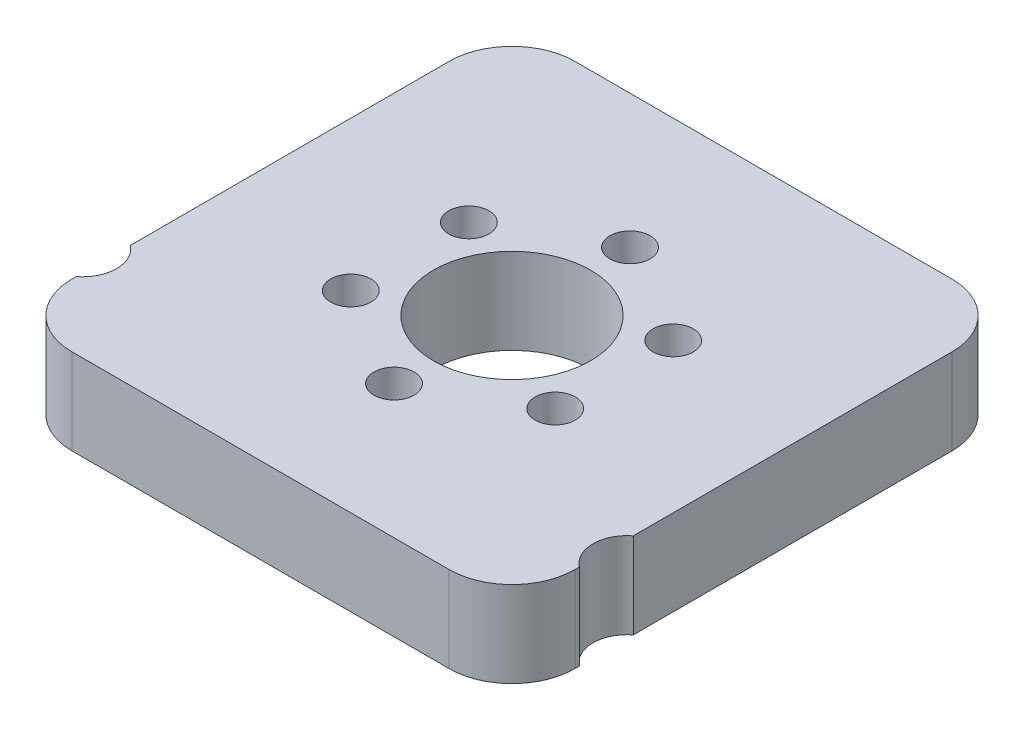
ISO-10303-21;
HEADER;
FILE_DESCRIPTION(('STEP AP214'),'2;1');
FILE_NAME('part.step','',(''),(''),'','','');
FILE_SCHEMA(('AUTOMOTIVE_DESIGN { 1 0 10303 214 1 1 1 1 }'));
ENDSEC;
DATA;
#1=APPLICATION_CONTEXT('core data for automotive mechanical design processes');
#2=APPLICATION_PROTOCOL_DEFINITION('international standard','automotive_design',2000,#1);
#3=PRODUCT_CONTEXT('',#1,'mechanical');
#4=PRODUCT('Part','Part','',(#3));
#5=PRODUCT_RELATED_PRODUCT_CATEGORY('part','',(#4));
#6=PRODUCT_DEFINITION_FORMATION('','',#4);
#7=PRODUCT_DEFINITION_CONTEXT('part definition',#1,'design');
#8=PRODUCT_DEFINITION('design','',#6,#7);
#9=PRODUCT_DEFINITION_SHAPE('','',#8);
#10=(LENGTH_UNIT() NAMED_UNIT(*) SI_UNIT(.MILLI.,.METRE.));
#11=(NAMED_UNIT(*) PLANE_ANGLE_UNIT() SI_UNIT($,.RADIAN.));
#12=(NAMED_UNIT(*) SI_UNIT($,.STERADIAN.) SOLID_ANGLE_UNIT());
#13=UNCERTAINTY_MEASURE_WITH_UNIT(LENGTH_MEASURE(1.E-05),#10,'distance_accuracy_value','');
#14=(GEOMETRIC_REPRESENTATION_CONTEXT(3) GLOBAL_UNCERTAINTY_ASSIGNED_CONTEXT((#13)) GLOBAL_UNIT_ASSIGNED_CONTEXT((#10,
#11,#12)) REPRESENTATION_CONTEXT('',''));
#15=CARTESIAN_POINT('',(0.,0.,0.));
#16=DIRECTION('',(0.,0.,1.));
#17=DIRECTION('',(1.,0.,0.));
#18=AXIS2_PLACEMENT_3D('',#15,#16,#17);
#19=CARTESIAN_POINT('',(-21.6506350946094,6.825,12.5000000000009));
#20=DIRECTION('',(0.,-1.,0.));
#21=DIRECTION('',(0.,0.,-1.));
#22=AXIS2_PLACEMENT_3D('',#19,#20,#21);
#23=CYLINDRICAL_SURFACE('',#22,2.70726574872096);
#24=CARTESIAN_POINT('',(-21.6506350946094,0.,12.5000000000009));
#25=DIRECTION('',(0.,1.,0.));
#26=DIRECTION('',(0.,0.,1.));
#27=AXIS2_PLACEMENT_3D('',#24,#25,#26);
#28=CIRCLE('',#27,2.70726574872096);
#29=CARTESIAN_POINT('',(-20.,0.,14.6458545194504));
#30=VERTEX_POINT('',#29);
#31=CARTESIAN_POINT('',(-20.,0.,10.3541454805515));
#32=VERTEX_POINT('',#31);
#33=EDGE_CURVE('E153',#30,#32,#28,.T.);
#34=ORIENTED_EDGE('',*,*,#33,.F.);
#35=DIRECTION('',(0.,-1.,0.));
#36=VECTOR('',#35,1.);
#37=CARTESIAN_POINT('',(-20.,6.825,14.6458545194504));
#38=LINE('',#37,#36);
#39=CARTESIAN_POINT('',(-20.,6.825,14.6458545194504));
#40=VERTEX_POINT('',#39);
#41=EDGE_CURVE('E140',#40,#30,#38,.T.);
#42=ORIENTED_EDGE('',*,*,#41,.F.);
#43=CARTESIAN_POINT('',(-21.6506350946094,6.825,12.5000000000009));
#44=DIRECTION('',(0.,1.,0.));
#45=DIRECTION('',(0.,0.,1.));
#46=AXIS2_PLACEMENT_3D('',#43,#44,#45);
#47=CIRCLE('',#46,2.70726574872096);
#48=CARTESIAN_POINT('',(-20.,6.825,10.3541454805515));
#49=VERTEX_POINT('',#48);
#50=EDGE_CURVE('E147',#40,#49,#47,.T.);
#51=ORIENTED_EDGE('',*,*,#50,.T.);
#52=DIRECTION('',(0.,-1.,0.));
#53=VECTOR('',#52,1.);
#54=CARTESIAN_POINT('',(-20.,6.825,10.3541454805515));
#55=LINE('',#54,#53);
#56=EDGE_CURVE('E189',#49,#32,#55,.T.);
#57=ORIENTED_EDGE('',*,*,#56,.T.);
#58=EDGE_LOOP('',(#34,#42,#51,#57));
#59=FACE_BOUND('',#58,.T.);
#60=ADVANCED_FACE('F45',(#59),#23,.F.);
#61=CARTESIAN_POINT('',(-20.,6.825,0.));
#62=DIRECTION('',(-1.,0.,0.));
#63=DIRECTION('',(0.,0.,1.));
#64=AXIS2_PLACEMENT_3D('',#61,#62,#63);
#65=PLANE('',#64);
#66=DIRECTION('',(0.,0.,-1.));
#67=VECTOR('',#66,1.);
#68=CARTESIAN_POINT('',(-20.,0.,0.));
#69=LINE('',#68,#67);
#70=CARTESIAN_POINT('',(-20.,0.,15.));
#71=VERTEX_POINT('',#70);
#72=EDGE_CURVE('E192',#71,#30,#69,.T.);
#73=ORIENTED_EDGE('',*,*,#72,.F.);
#74=DIRECTION('',(0.,-1.,0.));
#75=VECTOR('',#74,1.);
#76=CARTESIAN_POINT('',(-20.,6.825,15.));
#77=LINE('',#76,#75);
#78=CARTESIAN_POINT('',(-20.,6.825,15.));
#79=VERTEX_POINT('',#78);
#80=EDGE_CURVE('E11',#71,#79,#77,.F.);
#81=ORIENTED_EDGE('',*,*,#80,.T.);
#82=DIRECTION('',(0.,0.,-1.));
#83=VECTOR('',#82,1.);
#84=CARTESIAN_POINT('',(-20.,6.825,0.));
#85=LINE('',#84,#83);
#86=EDGE_CURVE('E136',#79,#40,#85,.T.);
#87=ORIENTED_EDGE('',*,*,#86,.T.);
#88=ORIENTED_EDGE('',*,*,#41,.T.);
#89=EDGE_LOOP('',(#73,#81,#87,#88));
#90=FACE_BOUND('',#89,.T.);
#91=ADVANCED_FACE('F139',(#90),#65,.T.);
#92=CARTESIAN_POINT('',(0.,6.825,20.));
#93=DIRECTION('',(0.,0.,-1.));
#94=DIRECTION('',(-1.,0.,0.));
#95=AXIS2_PLACEMENT_3D('',#92,#93,#94);
#96=PLANE('',#95);
#97=DIRECTION('',(1.,0.,0.));
#98=VECTOR('',#97,1.);
#99=CARTESIAN_POINT('',(0.,0.,20.));
#100=LINE('',#99,#98);
#101=CARTESIAN_POINT('',(-15.,0.,20.));
#102=VERTEX_POINT('',#101);
#103=CARTESIAN_POINT('',(15.,0.,20.));
#104=VERTEX_POINT('',#103);
#105=EDGE_CURVE('E196',#102,#104,#100,.T.);
#106=ORIENTED_EDGE('',*,*,#105,.T.);
#107=DIRECTION('',(0.,-1.,0.));
#108=VECTOR('',#107,1.);
#109=CARTESIAN_POINT('',(15.,6.825,20.));
#110=LINE('',#109,#108);
#111=CARTESIAN_POINT('',(15.,6.825,20.));
#112=VERTEX_POINT('',#111);
#113=EDGE_CURVE('E239',#104,#112,#110,.F.);
#114=ORIENTED_EDGE('',*,*,#113,.T.);
#115=DIRECTION('',(1.,0.,0.));
#116=VECTOR('',#115,1.);
#117=CARTESIAN_POINT('',(0.,6.825,20.));
#118=LINE('',#117,#116);
#119=CARTESIAN_POINT('',(-15.,6.825,20.));
#120=VERTEX_POINT('',#119);
#121=EDGE_CURVE('E146',#120,#112,#118,.T.);
#122=ORIENTED_EDGE('',*,*,#121,.F.);
#123=DIRECTION('',(0.,-1.,0.));
#124=VECTOR('',#123,1.);
#125=CARTESIAN_POINT('',(-15.,0.,20.));
#126=LINE('',#125,#124);
#127=EDGE_CURVE('E235',#120,#102,#126,.T.);
#128=ORIENTED_EDGE('',*,*,#127,.T.);
#129=EDGE_LOOP('',(#106,#114,#122,#128));
#130=FACE_BOUND('',#129,.T.);
#131=ADVANCED_FACE('F366',(#130),#96,.F.);
#132=CARTESIAN_POINT('',(20.,6.825,0.));
#133=DIRECTION('',(-1.,0.,0.));
#134=DIRECTION('',(0.,0.,1.));
#135=AXIS2_PLACEMENT_3D('',#132,#133,#134);
#136=PLANE('',#135);
#137=DIRECTION('',(0.,0.,-1.));
#138=VECTOR('',#137,1.);
#139=CARTESIAN_POINT('',(20.,6.825,0.));
#140=LINE('',#139,#138);
#141=CARTESIAN_POINT('',(20.,6.825,15.));
#142=VERTEX_POINT('',#141);
#143=CARTESIAN_POINT('',(20.,6.825,14.6458545194452));
#144=VERTEX_POINT('',#143);
#145=EDGE_CURVE('E174',#142,#144,#140,.T.);
#146=ORIENTED_EDGE('',*,*,#145,.F.);
#147=DIRECTION('',(0.,-1.,0.));
#148=VECTOR('',#147,1.);
#149=CARTESIAN_POINT('',(20.,6.825,15.));
#150=LINE('',#149,#148);
#151=CARTESIAN_POINT('',(20.,0.,15.));
#152=VERTEX_POINT('',#151);
#153=EDGE_CURVE('E155',#142,#152,#150,.T.);
#154=ORIENTED_EDGE('',*,*,#153,.T.);
#155=DIRECTION('',(0.,0.,-1.));
#156=VECTOR('',#155,1.);
#157=CARTESIAN_POINT('',(20.,0.,0.));
#158=LINE('',#157,#156);
#159=CARTESIAN_POINT('',(20.,0.,14.6458545194452));
#160=VERTEX_POINT('',#159);
#161=EDGE_CURVE('E200',#152,#160,#158,.T.);
#162=ORIENTED_EDGE('',*,*,#161,.T.);
#163=DIRECTION('',(0.,-1.,0.));
#164=VECTOR('',#163,1.);
#165=CARTESIAN_POINT('',(20.,6.825,14.6458545194452));
#166=LINE('',#165,#164);
#167=EDGE_CURVE('E156',#144,#160,#166,.T.);
#168=ORIENTED_EDGE('',*,*,#167,.F.);
#169=EDGE_LOOP('',(#146,#154,#162,#168));
#170=FACE_BOUND('',#169,.T.);
#171=ADVANCED_FACE('F401',(#170),#136,.F.);
#172=CARTESIAN_POINT('',(21.6506350946126,6.825,12.4999999999991));
#173=DIRECTION('',(0.,-1.,0.));
#174=DIRECTION('',(0.,0.,-1.));
#175=AXIS2_PLACEMENT_3D('',#172,#173,#174);
#176=CYLINDRICAL_SURFACE('',#175,2.70726574872033);
#177=CARTESIAN_POINT('',(21.6506350946126,0.,12.4999999999991));
#178=DIRECTION('',(0.,1.,0.));
#179=DIRECTION('',(0.,0.,1.));
#180=AXIS2_PLACEMENT_3D('',#177,#178,#179);
#181=CIRCLE('',#180,2.70726574872033);
#182=CARTESIAN_POINT('',(20.,0.,10.3541454805529));
#183=VERTEX_POINT('',#182);
#184=EDGE_CURVE('E203',#183,#160,#181,.T.);
#185=ORIENTED_EDGE('',*,*,#184,.F.);
#186=DIRECTION('',(0.,-1.,0.));
#187=VECTOR('',#186,1.);
#188=CARTESIAN_POINT('',(20.,6.825,10.3541454805529));
#189=LINE('',#188,#187);
#190=CARTESIAN_POINT('',(20.,6.825,10.3541454805529));
#191=VERTEX_POINT('',#190);
#192=EDGE_CURVE('E214',#191,#183,#189,.T.);
#193=ORIENTED_EDGE('',*,*,#192,.F.);
#194=CARTESIAN_POINT('',(21.6506350946126,6.825,12.4999999999991));
#195=DIRECTION('',(0.,1.,0.));
#196=DIRECTION('',(0.,0.,1.));
#197=AXIS2_PLACEMENT_3D('',#194,#195,#196);
#198=CIRCLE('',#197,2.70726574872033);
#199=EDGE_CURVE('E177',#191,#144,#198,.T.);
#200=ORIENTED_EDGE('',*,*,#199,.T.);
#201=ORIENTED_EDGE('',*,*,#167,.T.);
#202=EDGE_LOOP('',(#185,#193,#200,#201));
#203=FACE_BOUND('',#202,.T.);
#204=ADVANCED_FACE('F396',(#203),#176,.F.);
#205=CARTESIAN_POINT('',(20.,0.,-15.));
#206=VERTEX_POINT('',#205);
#207=EDGE_CURVE('E204',#183,#206,#158,.T.);
#208=ORIENTED_EDGE('',*,*,#207,.T.);
#209=DIRECTION('',(0.,-1.,0.));
#210=VECTOR('',#209,1.);
#211=CARTESIAN_POINT('',(20.,6.825,-15.));
#212=LINE('',#211,#210);
#213=CARTESIAN_POINT('',(20.,6.825,-15.));
#214=VERTEX_POINT('',#213);
#215=EDGE_CURVE('E259',#206,#214,#212,.F.);
#216=ORIENTED_EDGE('',*,*,#215,.T.);
#217=EDGE_CURVE('E178',#191,#214,#140,.T.);
#218=ORIENTED_EDGE('',*,*,#217,.F.);
#219=ORIENTED_EDGE('',*,*,#192,.T.);
#220=EDGE_LOOP('',(#208,#216,#218,#219));
#221=FACE_BOUND('',#220,.T.);
#222=ADVANCED_FACE('F392',(#221),#136,.F.);
#223=CARTESIAN_POINT('',(0.,6.825,-20.));
#224=DIRECTION('',(0.,0.,-1.));
#225=DIRECTION('',(-1.,0.,0.));
#226=AXIS2_PLACEMENT_3D('',#223,#224,#225);
#227=PLANE('',#226);
#228=DIRECTION('',(1.,0.,0.));
#229=VECTOR('',#228,1.);
#230=CARTESIAN_POINT('',(0.,6.825,-20.));
#231=LINE('',#230,#229);
#232=CARTESIAN_POINT('',(-15.,6.825,-20.));
#233=VERTEX_POINT('',#232);
#234=CARTESIAN_POINT('',(15.,6.825,-20.));
#235=VERTEX_POINT('',#234);
#236=EDGE_CURVE('E182',#233,#235,#231,.T.);
#237=ORIENTED_EDGE('',*,*,#236,.T.);
#238=DIRECTION('',(0.,-1.,0.));
#239=VECTOR('',#238,1.);
#240=CARTESIAN_POINT('',(15.,0.,-20.));
#241=LINE('',#240,#239);
#242=CARTESIAN_POINT('',(15.,0.,-20.));
#243=VERTEX_POINT('',#242);
#244=EDGE_CURVE('E255',#235,#243,#241,.T.);
#245=ORIENTED_EDGE('',*,*,#244,.T.);
#246=DIRECTION('',(1.,0.,0.));
#247=VECTOR('',#246,1.);
#248=CARTESIAN_POINT('',(0.,0.,-20.));
#249=LINE('',#248,#247);
#250=CARTESIAN_POINT('',(-15.,0.,-20.));
#251=VERTEX_POINT('',#250);
#252=EDGE_CURVE('E208',#251,#243,#249,.T.);
#253=ORIENTED_EDGE('',*,*,#252,.F.);
#254=DIRECTION('',(0.,-1.,0.));
#255=VECTOR('',#254,1.);
#256=CARTESIAN_POINT('',(-15.,6.825,-20.));
#257=LINE('',#256,#255);
#258=EDGE_CURVE('E252',#251,#233,#257,.F.);
#259=ORIENTED_EDGE('',*,*,#258,.T.);
#260=EDGE_LOOP('',(#237,#245,#253,#259));
#261=FACE_BOUND('',#260,.T.);
#262=ADVANCED_FACE('F386',(#261),#227,.T.);
#263=CARTESIAN_POINT('',(-20.,6.825,-15.));
#264=VERTEX_POINT('',#263);
#265=EDGE_CURVE('E149',#49,#264,#85,.T.);
#266=ORIENTED_EDGE('',*,*,#265,.T.);
#267=DIRECTION('',(0.,-1.,0.));
#268=VECTOR('',#267,1.);
#269=CARTESIAN_POINT('',(-20.,6.825,-15.));
#270=LINE('',#269,#268);
#271=CARTESIAN_POINT('',(-20.,0.,-15.));
#272=VERTEX_POINT('',#271);
#273=EDGE_CURVE('E54',#264,#272,#270,.T.);
#274=ORIENTED_EDGE('',*,*,#273,.T.);
#275=EDGE_CURVE('E166',#32,#272,#69,.T.);
#276=ORIENTED_EDGE('',*,*,#275,.F.);
#277=ORIENTED_EDGE('',*,*,#56,.F.);
#278=EDGE_LOOP('',(#266,#274,#276,#277));
#279=FACE_BOUND('',#278,.T.);
#280=ADVANCED_FACE('F267',(#279),#65,.T.);
#281=CARTESIAN_POINT('',(0.,6.825,0.));
#282=DIRECTION('',(0.,-1.,0.));
#283=DIRECTION('',(0.,0.,-1.));
#284=AXIS2_PLACEMENT_3D('',#281,#282,#283);
#285=CYLINDRICAL_SURFACE('',#284,6.25);
#286=CARTESIAN_POINT('',(0.,6.825,0.));
#287=DIRECTION('',(0.,1.,0.));
#288=DIRECTION('',(0.,0.,1.));
#289=AXIS2_PLACEMENT_3D('',#286,#287,#288);
#290=CIRCLE('',#289,6.25);
#291=CARTESIAN_POINT('',(0.,6.825,6.25));
#292=VERTEX_POINT('',#291);
#293=EDGE_CURVE('E185',#292,#292,#290,.T.);
#294=ORIENTED_EDGE('',*,*,#293,.T.);
#295=EDGE_LOOP('',(#294));
#296=FACE_BOUND('',#295,.T.);
#297=CARTESIAN_POINT('',(0.,0.,0.));
#298=DIRECTION('',(0.,1.,0.));
#299=DIRECTION('',(0.,0.,1.));
#300=AXIS2_PLACEMENT_3D('',#297,#298,#299);
#301=CIRCLE('',#300,6.25);
#302=CARTESIAN_POINT('',(0.,0.,6.25));
#303=VERTEX_POINT('',#302);
#304=EDGE_CURVE('E162',#303,#303,#301,.T.);
#305=ORIENTED_EDGE('',*,*,#304,.F.);
#306=EDGE_LOOP('',(#305));
#307=FACE_BOUND('',#306,.T.);
#308=ADVANCED_FACE('F335',(#296,#307),#285,.F.);
#309=CARTESIAN_POINT('',(0.,6.825,0.));
#310=DIRECTION('',(0.,1.,0.));
#311=DIRECTION('',(0.,0.,1.));
#312=AXIS2_PLACEMENT_3D('',#309,#310,#311);
#313=PLANE('',#312);
#314=CARTESIAN_POINT('',(0.,6.825,9.385));
#315=DIRECTION('',(0.,1.,0.));
#316=DIRECTION('',(0.,0.,1.));
#317=AXIS2_PLACEMENT_3D('',#314,#315,#316);
#318=CIRCLE('',#317,1.6);
#319=CARTESIAN_POINT('',(0.,6.825,10.985));
#320=VERTEX_POINT('',#319);
#321=EDGE_CURVE('E280',#320,#320,#318,.T.);
#322=ORIENTED_EDGE('',*,*,#321,.F.);
#323=EDGE_LOOP('',(#322));
#324=FACE_BOUND('',#323,.T.);
#325=CARTESIAN_POINT('',(8.1276484145169,6.825,4.69250000000009));
#326=DIRECTION('',(0.,1.,0.));
#327=DIRECTION('',(0.,0.,1.));
#328=AXIS2_PLACEMENT_3D('',#325,#326,#327);
#329=CIRCLE('',#328,1.6);
#330=CARTESIAN_POINT('',(8.1276484145169,6.825,6.29250000000009));
#331=VERTEX_POINT('',#330);
#332=EDGE_CURVE('E314',#331,#331,#329,.T.);
#333=ORIENTED_EDGE('',*,*,#332,.F.);
#334=EDGE_LOOP('',(#333));
#335=FACE_BOUND('',#334,.T.);
#336=CARTESIAN_POINT('',(8.127648414517,6.825,-4.69249999999992));
#337=DIRECTION('',(0.,1.,0.));
#338=DIRECTION('',(0.,0.,1.));
#339=AXIS2_PLACEMENT_3D('',#336,#337,#338);
#340=CIRCLE('',#339,1.6);
#341=CARTESIAN_POINT('',(8.127648414517,6.825,-3.09249999999992));
#342=VERTEX_POINT('',#341);
#343=EDGE_CURVE('E308',#342,#342,#340,.T.);
#344=ORIENTED_EDGE('',*,*,#343,.F.);
#345=EDGE_LOOP('',(#344));
#346=FACE_BOUND('',#345,.T.);
#347=CARTESIAN_POINT('',(0.,6.825,-9.385));
#348=DIRECTION('',(0.,1.,0.));
#349=DIRECTION('',(0.,0.,1.));
#350=AXIS2_PLACEMENT_3D('',#347,#348,#349);
#351=CIRCLE('',#350,1.6);
#352=CARTESIAN_POINT('',(0.,6.825,-7.785));
#353=VERTEX_POINT('',#352);
#354=EDGE_CURVE('E300',#353,#353,#351,.T.);
#355=ORIENTED_EDGE('',*,*,#354,.F.);
#356=EDGE_LOOP('',(#355));
#357=FACE_BOUND('',#356,.T.);
#358=CARTESIAN_POINT('',(-8.12764841451694,6.825,-4.69250000000004));
#359=DIRECTION('',(0.,1.,0.));
#360=DIRECTION('',(0.,0.,1.));
#361=AXIS2_PLACEMENT_3D('',#358,#359,#360);
#362=CIRCLE('',#361,1.6);
#363=CARTESIAN_POINT('',(-8.12764841451694,6.825,-3.09250000000004));
#364=VERTEX_POINT('',#363);
#365=EDGE_CURVE('E292',#364,#364,#362,.T.);
#366=ORIENTED_EDGE('',*,*,#365,.F.);
#367=EDGE_LOOP('',(#366));
#368=FACE_BOUND('',#367,.T.);
#369=CARTESIAN_POINT('',(-8.12764841451697,6.825,4.69249999999998));
#370=DIRECTION('',(0.,1.,0.));
#371=DIRECTION('',(0.,0.,1.));
#372=AXIS2_PLACEMENT_3D('',#369,#370,#371);
#373=CIRCLE('',#372,1.6);
#374=CARTESIAN_POINT('',(-8.12764841451697,6.825,6.29249999999998));
#375=VERTEX_POINT('',#374);
#376=EDGE_CURVE('E284',#375,#375,#373,.T.);
#377=ORIENTED_EDGE('',*,*,#376,.F.);
#378=EDGE_LOOP('',(#377));
#379=FACE_BOUND('',#378,.T.);
#380=ORIENTED_EDGE('',*,*,#121,.T.);
#381=CARTESIAN_POINT('',(15.,6.825,15.));
#382=DIRECTION('',(0.,1.,0.));
#383=DIRECTION('',(0.,0.,1.));
#384=AXIS2_PLACEMENT_3D('',#381,#382,#383);
#385=CIRCLE('',#384,5.);
#386=EDGE_CURVE('E249',#112,#142,#385,.T.);
#387=ORIENTED_EDGE('',*,*,#386,.T.);
#388=ORIENTED_EDGE('',*,*,#145,.T.);
#389=ORIENTED_EDGE('',*,*,#199,.F.);
#390=ORIENTED_EDGE('',*,*,#217,.T.);
#391=CARTESIAN_POINT('',(15.,6.825,-15.));
#392=DIRECTION('',(0.,1.,0.));
#393=DIRECTION('',(0.,0.,1.));
#394=AXIS2_PLACEMENT_3D('',#391,#392,#393);
#395=CIRCLE('',#394,5.);
#396=EDGE_CURVE('E67',#214,#235,#395,.T.);
#397=ORIENTED_EDGE('',*,*,#396,.T.);
#398=ORIENTED_EDGE('',*,*,#236,.F.);
#399=CARTESIAN_POINT('',(-15.,6.825,-15.));
#400=DIRECTION('',(0.,1.,0.));
#401=DIRECTION('',(0.,0.,1.));
#402=AXIS2_PLACEMENT_3D('',#399,#400,#401);
#403=CIRCLE('',#402,5.);
#404=EDGE_CURVE('E61',#233,#264,#403,.T.);
#405=ORIENTED_EDGE('',*,*,#404,.T.);
#406=ORIENTED_EDGE('',*,*,#265,.F.);
#407=ORIENTED_EDGE('',*,*,#50,.F.);
#408=ORIENTED_EDGE('',*,*,#86,.F.);
#409=CARTESIAN_POINT('',(-15.,6.825,15.));
#410=DIRECTION('',(0.,1.,0.));
#411=DIRECTION('',(0.,0.,1.));
#412=AXIS2_PLACEMENT_3D('',#409,#410,#411);
#413=CIRCLE('',#412,5.);
#414=EDGE_CURVE('E242',#79,#120,#413,.T.);
#415=ORIENTED_EDGE('',*,*,#414,.T.);
#416=EDGE_LOOP('',(#380,#387,#388,#389,#390,#397,#398,#405,#406,#407,#408,#415));
#417=FACE_BOUND('',#416,.T.);
#418=ORIENTED_EDGE('',*,*,#293,.F.);
#419=EDGE_LOOP('',(#418));
#420=FACE_BOUND('',#419,.T.);
#421=ADVANCED_FACE('F159',(#324,#335,#346,#357,#368,#379,#417,#420),#313,.T.);
#422=CARTESIAN_POINT('',(0.,0.,0.));
#423=DIRECTION('',(0.,1.,0.));
#424=DIRECTION('',(0.,0.,1.));
#425=AXIS2_PLACEMENT_3D('',#422,#423,#424);
#426=PLANE('',#425);
#427=CARTESIAN_POINT('',(0.,0.,9.385));
#428=DIRECTION('',(0.,1.,0.));
#429=DIRECTION('',(0.,0.,1.));
#430=AXIS2_PLACEMENT_3D('',#427,#428,#429);
#431=CIRCLE('',#430,1.6);
#432=CARTESIAN_POINT('',(0.,0.,10.985));
#433=VERTEX_POINT('',#432);
#434=EDGE_CURVE('E193',#433,#433,#431,.T.);
#435=ORIENTED_EDGE('',*,*,#434,.T.);
#436=EDGE_LOOP('',(#435));
#437=FACE_BOUND('',#436,.T.);
#438=CARTESIAN_POINT('',(8.1276484145169,0.,4.69250000000009));
#439=DIRECTION('',(0.,1.,0.));
#440=DIRECTION('',(0.,0.,1.));
#441=AXIS2_PLACEMENT_3D('',#438,#439,#440);
#442=CIRCLE('',#441,1.6);
#443=CARTESIAN_POINT('',(8.1276484145169,0.,6.29250000000009));
#444=VERTEX_POINT('',#443);
#445=EDGE_CURVE('E317',#444,#444,#442,.T.);
#446=ORIENTED_EDGE('',*,*,#445,.T.);
#447=EDGE_LOOP('',(#446));
#448=FACE_BOUND('',#447,.T.);
#449=CARTESIAN_POINT('',(8.127648414517,0.,-4.69249999999992));
#450=DIRECTION('',(0.,1.,0.));
#451=DIRECTION('',(0.,0.,1.));
#452=AXIS2_PLACEMENT_3D('',#449,#450,#451);
#453=CIRCLE('',#452,1.6);
#454=CARTESIAN_POINT('',(8.127648414517,0.,-3.09249999999992));
#455=VERTEX_POINT('',#454);
#456=EDGE_CURVE('E169',#455,#455,#453,.T.);
#457=ORIENTED_EDGE('',*,*,#456,.T.);
#458=EDGE_LOOP('',(#457));
#459=FACE_BOUND('',#458,.T.);
#460=CARTESIAN_POINT('',(0.,0.,-9.385));
#461=DIRECTION('',(0.,1.,0.));
#462=DIRECTION('',(0.,0.,1.));
#463=AXIS2_PLACEMENT_3D('',#460,#461,#462);
#464=CIRCLE('',#463,1.6);
#465=CARTESIAN_POINT('',(0.,0.,-7.785));
#466=VERTEX_POINT('',#465);
#467=EDGE_CURVE('E304',#466,#466,#464,.T.);
#468=ORIENTED_EDGE('',*,*,#467,.T.);
#469=EDGE_LOOP('',(#468));
#470=FACE_BOUND('',#469,.T.);
#471=CARTESIAN_POINT('',(-8.12764841451694,0.,-4.69250000000004));
#472=DIRECTION('',(0.,1.,0.));
#473=DIRECTION('',(0.,0.,1.));
#474=AXIS2_PLACEMENT_3D('',#471,#472,#473);
#475=CIRCLE('',#474,1.6);
#476=CARTESIAN_POINT('',(-8.12764841451694,0.,-3.09250000000004));
#477=VERTEX_POINT('',#476);
#478=EDGE_CURVE('E296',#477,#477,#475,.T.);
#479=ORIENTED_EDGE('',*,*,#478,.T.);
#480=EDGE_LOOP('',(#479));
#481=FACE_BOUND('',#480,.T.);
#482=CARTESIAN_POINT('',(-8.12764841451697,0.,4.69249999999998));
#483=DIRECTION('',(0.,1.,0.));
#484=DIRECTION('',(0.,0.,1.));
#485=AXIS2_PLACEMENT_3D('',#482,#483,#484);
#486=CIRCLE('',#485,1.6);
#487=CARTESIAN_POINT('',(-8.12764841451697,0.,6.29249999999998));
#488=VERTEX_POINT('',#487);
#489=EDGE_CURVE('E288',#488,#488,#486,.T.);
#490=ORIENTED_EDGE('',*,*,#489,.T.);
#491=EDGE_LOOP('',(#490));
#492=FACE_BOUND('',#491,.T.);
#493=ORIENTED_EDGE('',*,*,#161,.F.);
#494=CARTESIAN_POINT('',(15.,0.,15.));
#495=DIRECTION('',(0.,1.,0.));
#496=DIRECTION('',(0.,0.,1.));
#497=AXIS2_PLACEMENT_3D('',#494,#495,#496);
#498=CIRCLE('',#497,5.);
#499=EDGE_CURVE('E232',#152,#104,#498,.F.);
#500=ORIENTED_EDGE('',*,*,#499,.T.);
#501=ORIENTED_EDGE('',*,*,#105,.F.);
#502=CARTESIAN_POINT('',(-15.,0.,15.));
#503=DIRECTION('',(0.,1.,0.));
#504=DIRECTION('',(0.,0.,1.));
#505=AXIS2_PLACEMENT_3D('',#502,#503,#504);
#506=CIRCLE('',#505,5.);
#507=EDGE_CURVE('E223',#102,#71,#506,.F.);
#508=ORIENTED_EDGE('',*,*,#507,.T.);
#509=ORIENTED_EDGE('',*,*,#72,.T.);
#510=ORIENTED_EDGE('',*,*,#33,.T.);
#511=ORIENTED_EDGE('',*,*,#275,.T.);
#512=CARTESIAN_POINT('',(-15.,0.,-15.));
#513=DIRECTION('',(0.,1.,0.));
#514=DIRECTION('',(0.,0.,1.));
#515=AXIS2_PLACEMENT_3D('',#512,#513,#514);
#516=CIRCLE('',#515,5.);
#517=EDGE_CURVE('E226',#272,#251,#516,.F.);
#518=ORIENTED_EDGE('',*,*,#517,.T.);
#519=ORIENTED_EDGE('',*,*,#252,.T.);
#520=CARTESIAN_POINT('',(15.,0.,-15.));
#521=DIRECTION('',(0.,1.,0.));
#522=DIRECTION('',(0.,0.,1.));
#523=AXIS2_PLACEMENT_3D('',#520,#521,#522);
#524=CIRCLE('',#523,5.);
#525=EDGE_CURVE('E229',#243,#206,#524,.F.);
#526=ORIENTED_EDGE('',*,*,#525,.T.);
#527=ORIENTED_EDGE('',*,*,#207,.F.);
#528=ORIENTED_EDGE('',*,*,#184,.T.);
#529=EDGE_LOOP('',(#493,#500,#501,#508,#509,#510,#511,#518,#519,#526,#527,#528));
#530=FACE_BOUND('',#529,.T.);
#531=ORIENTED_EDGE('',*,*,#304,.T.);
#532=EDGE_LOOP('',(#531));
#533=FACE_BOUND('',#532,.T.);
#534=ADVANCED_FACE('F271',(#437,#448,#459,#470,#481,#492,#530,#533),#426,.F.);
#535=CARTESIAN_POINT('',(-8.12764841451697,0.,4.69249999999998));
#536=DIRECTION('',(0.,1.,0.));
#537=DIRECTION('',(0.,0.,1.));
#538=AXIS2_PLACEMENT_3D('',#535,#536,#537);
#539=CYLINDRICAL_SURFACE('',#538,1.6);
#540=ORIENTED_EDGE('',*,*,#489,.F.);
#541=EDGE_LOOP('',(#540));
#542=FACE_BOUND('',#541,.T.);
#543=ORIENTED_EDGE('',*,*,#376,.T.);
#544=EDGE_LOOP('',(#543));
#545=FACE_BOUND('',#544,.T.);
#546=ADVANCED_FACE('F346',(#542,#545),#539,.F.);
#547=CARTESIAN_POINT('',(-8.12764841451694,0.,-4.69250000000004));
#548=DIRECTION('',(0.,1.,0.));
#549=DIRECTION('',(0.,0.,1.));
#550=AXIS2_PLACEMENT_3D('',#547,#548,#549);
#551=CYLINDRICAL_SURFACE('',#550,1.6);
#552=ORIENTED_EDGE('',*,*,#478,.F.);
#553=EDGE_LOOP('',(#552));
#554=FACE_BOUND('',#553,.T.);
#555=ORIENTED_EDGE('',*,*,#365,.T.);
#556=EDGE_LOOP('',(#555));
#557=FACE_BOUND('',#556,.T.);
#558=ADVANCED_FACE('F348',(#554,#557),#551,.F.);
#559=CARTESIAN_POINT('',(0.,0.,-9.385));
#560=DIRECTION('',(0.,1.,0.));
#561=DIRECTION('',(0.,0.,1.));
#562=AXIS2_PLACEMENT_3D('',#559,#560,#561);
#563=CYLINDRICAL_SURFACE('',#562,1.6);
#564=ORIENTED_EDGE('',*,*,#467,.F.);
#565=EDGE_LOOP('',(#564));
#566=FACE_BOUND('',#565,.T.);
#567=ORIENTED_EDGE('',*,*,#354,.T.);
#568=EDGE_LOOP('',(#567));
#569=FACE_BOUND('',#568,.T.);
#570=ADVANCED_FACE('F355',(#566,#569),#563,.F.);
#571=CARTESIAN_POINT('',(8.127648414517,0.,-4.69249999999992));
#572=DIRECTION('',(0.,1.,0.));
#573=DIRECTION('',(0.,0.,1.));
#574=AXIS2_PLACEMENT_3D('',#571,#572,#573);
#575=CYLINDRICAL_SURFACE('',#574,1.6);
#576=ORIENTED_EDGE('',*,*,#456,.F.);
#577=EDGE_LOOP('',(#576));
#578=FACE_BOUND('',#577,.T.);
#579=ORIENTED_EDGE('',*,*,#343,.T.);
#580=EDGE_LOOP('',(#579));
#581=FACE_BOUND('',#580,.T.);
#582=ADVANCED_FACE('F329',(#578,#581),#575,.F.);
#583=CARTESIAN_POINT('',(8.1276484145169,0.,4.69250000000009));
#584=DIRECTION('',(0.,1.,0.));
#585=DIRECTION('',(0.,0.,1.));
#586=AXIS2_PLACEMENT_3D('',#583,#584,#585);
#587=CYLINDRICAL_SURFACE('',#586,1.6);
#588=ORIENTED_EDGE('',*,*,#445,.F.);
#589=EDGE_LOOP('',(#588));
#590=FACE_BOUND('',#589,.T.);
#591=ORIENTED_EDGE('',*,*,#332,.T.);
#592=EDGE_LOOP('',(#591));
#593=FACE_BOUND('',#592,.T.);
#594=ADVANCED_FACE('F325',(#590,#593),#587,.F.);
#595=CARTESIAN_POINT('',(0.,0.,9.385));
#596=DIRECTION('',(0.,1.,0.));
#597=DIRECTION('',(0.,0.,1.));
#598=AXIS2_PLACEMENT_3D('',#595,#596,#597);
#599=CYLINDRICAL_SURFACE('',#598,1.6);
#600=ORIENTED_EDGE('',*,*,#434,.F.);
#601=EDGE_LOOP('',(#600));
#602=FACE_BOUND('',#601,.T.);
#603=ORIENTED_EDGE('',*,*,#321,.T.);
#604=EDGE_LOOP('',(#603));
#605=FACE_BOUND('',#604,.T.);
#606=ADVANCED_FACE('F328',(#602,#605),#599,.F.);
#607=CARTESIAN_POINT('',(15.,6.825,15.));
#608=DIRECTION('',(0.,-1.,0.));
#609=DIRECTION('',(0.,0.,-1.));
#610=AXIS2_PLACEMENT_3D('',#607,#608,#609);
#611=CYLINDRICAL_SURFACE('',#610,5.);
#612=ORIENTED_EDGE('',*,*,#386,.F.);
#613=ORIENTED_EDGE('',*,*,#113,.F.);
#614=ORIENTED_EDGE('',*,*,#499,.F.);
#615=ORIENTED_EDGE('',*,*,#153,.F.);
#616=EDGE_LOOP('',(#612,#613,#614,#615));
#617=FACE_BOUND('',#616,.T.);
#618=ADVANCED_FACE('F371',(#617),#611,.T.);
#619=CARTESIAN_POINT('',(15.,6.825,-15.));
#620=DIRECTION('',(0.,1.,0.));
#621=DIRECTION('',(0.,0.,1.));
#622=AXIS2_PLACEMENT_3D('',#619,#620,#621);
#623=CYLINDRICAL_SURFACE('',#622,5.);
#624=ORIENTED_EDGE('',*,*,#396,.F.);
#625=ORIENTED_EDGE('',*,*,#215,.F.);
#626=ORIENTED_EDGE('',*,*,#525,.F.);
#627=ORIENTED_EDGE('',*,*,#244,.F.);
#628=EDGE_LOOP('',(#624,#625,#626,#627));
#629=FACE_BOUND('',#628,.T.);
#630=ADVANCED_FACE('F374',(#629),#623,.T.);
#631=CARTESIAN_POINT('',(-15.,6.825,-15.));
#632=DIRECTION('',(0.,-1.,0.));
#633=DIRECTION('',(0.,0.,-1.));
#634=AXIS2_PLACEMENT_3D('',#631,#632,#633);
#635=CYLINDRICAL_SURFACE('',#634,5.);
#636=ORIENTED_EDGE('',*,*,#404,.F.);
#637=ORIENTED_EDGE('',*,*,#258,.F.);
#638=ORIENTED_EDGE('',*,*,#517,.F.);
#639=ORIENTED_EDGE('',*,*,#273,.F.);
#640=EDGE_LOOP('',(#636,#637,#638,#639));
#641=FACE_BOUND('',#640,.T.);
#642=ADVANCED_FACE('F377',(#641),#635,.T.);
#643=CARTESIAN_POINT('',(-15.,6.825,15.));
#644=DIRECTION('',(0.,1.,0.));
#645=DIRECTION('',(0.,0.,1.));
#646=AXIS2_PLACEMENT_3D('',#643,#644,#645);
#647=CYLINDRICAL_SURFACE('',#646,5.);
#648=ORIENTED_EDGE('',*,*,#414,.F.);
#649=ORIENTED_EDGE('',*,*,#80,.F.);
#650=ORIENTED_EDGE('',*,*,#507,.F.);
#651=ORIENTED_EDGE('',*,*,#127,.F.);
#652=EDGE_LOOP('',(#648,#649,#650,#651));
#653=FACE_BOUND('',#652,.T.);
#654=ADVANCED_FACE('F47',(#653),#647,.T.);
#655=CLOSED_SHELL('',(#60,#91,#131,#171,#204,#222,#262,#280,#308,#421,#534,#546,#558,#570,#582,
#594,#606,#618,#630,#642,#654));
#656=MANIFOLD_SOLID_BREP('B2',#655);
#657=ADVANCED_BREP_SHAPE_REPRESENTATION('',(#18,#656),#14);
#658=SHAPE_DEFINITION_REPRESENTATION(#9,#657);
ENDSEC;
END-ISO-10303-21;
